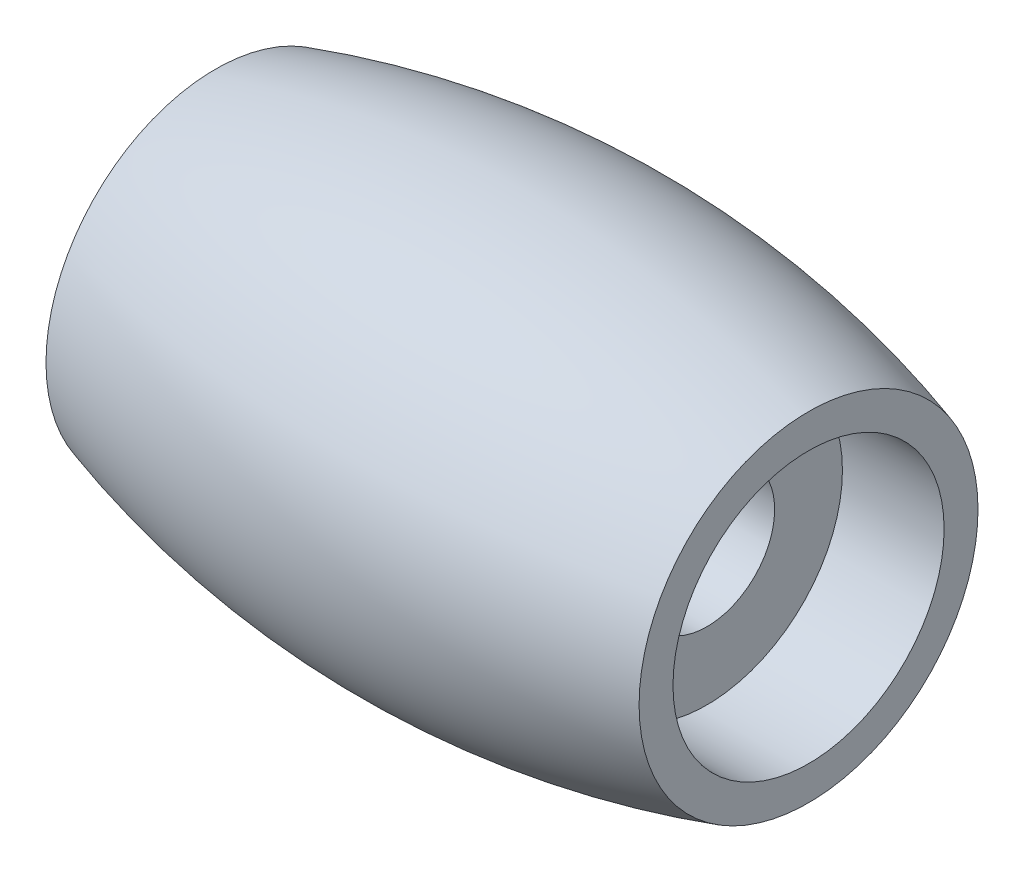
ISO-10303-21;
HEADER;
FILE_DESCRIPTION(('STEP AP214'),'2;1');
FILE_NAME('part.step','',(''),(''),'','','');
FILE_SCHEMA(('AUTOMOTIVE_DESIGN { 1 0 10303 214 1 1 1 1 }'));
ENDSEC;
DATA;
#1=APPLICATION_CONTEXT('core data for automotive mechanical design processes');
#2=APPLICATION_PROTOCOL_DEFINITION('international standard','automotive_design',2000,#1);
#3=PRODUCT_CONTEXT('',#1,'mechanical');
#4=PRODUCT('Part','Part','',(#3));
#5=PRODUCT_RELATED_PRODUCT_CATEGORY('part','',(#4));
#6=PRODUCT_DEFINITION_FORMATION('','',#4);
#7=PRODUCT_DEFINITION_CONTEXT('part definition',#1,'design');
#8=PRODUCT_DEFINITION('design','',#6,#7);
#9=PRODUCT_DEFINITION_SHAPE('','',#8);
#10=(LENGTH_UNIT() NAMED_UNIT(*) SI_UNIT(.MILLI.,.METRE.));
#11=(NAMED_UNIT(*) PLANE_ANGLE_UNIT() SI_UNIT($,.RADIAN.));
#12=(NAMED_UNIT(*) SI_UNIT($,.STERADIAN.) SOLID_ANGLE_UNIT());
#13=UNCERTAINTY_MEASURE_WITH_UNIT(LENGTH_MEASURE(1.E-05),#10,'distance_accuracy_value','');
#14=(GEOMETRIC_REPRESENTATION_CONTEXT(3) GLOBAL_UNCERTAINTY_ASSIGNED_CONTEXT((#13)) GLOBAL_UNIT_ASSIGNED_CONTEXT((#10,
#11,#12)) REPRESENTATION_CONTEXT('',''));
#15=CARTESIAN_POINT('',(0.,0.,0.));
#16=DIRECTION('',(0.,0.,1.));
#17=DIRECTION('',(1.,0.,0.));
#18=AXIS2_PLACEMENT_3D('',#15,#16,#17);
#19=CARTESIAN_POINT('',(2.875,1.,0.));
#20=DIRECTION('',(-1.,0.,0.));
#21=DIRECTION('',(0.,0.,1.));
#22=AXIS2_PLACEMENT_3D('',#19,#20,#21);
#23=PLANE('',#22);
#24=CARTESIAN_POINT('',(2.875,0.,0.));
#25=DIRECTION('',(-1.,0.,0.));
#26=DIRECTION('',(0.,0.,1.));
#27=AXIS2_PLACEMENT_3D('',#24,#25,#26);
#28=CIRCLE('',#27,2.);
#29=CARTESIAN_POINT('',(2.875,0.,2.));
#30=VERTEX_POINT('',#29);
#31=EDGE_CURVE('E78',#30,#30,#28,.T.);
#32=ORIENTED_EDGE('',*,*,#31,.F.);
#33=EDGE_LOOP('',(#32));
#34=FACE_BOUND('',#33,.T.);
#35=CARTESIAN_POINT('',(2.875,0.,0.));
#36=DIRECTION('',(-1.,0.,0.));
#37=DIRECTION('',(0.,0.,1.));
#38=AXIS2_PLACEMENT_3D('',#35,#36,#37);
#39=CIRCLE('',#38,1.);
#40=CARTESIAN_POINT('',(2.875,0.,1.));
#41=VERTEX_POINT('',#40);
#42=EDGE_CURVE('E10',#41,#41,#39,.T.);
#43=ORIENTED_EDGE('',*,*,#42,.T.);
#44=EDGE_LOOP('',(#43));
#45=FACE_BOUND('',#44,.T.);
#46=ADVANCED_FACE('F43',(#34,#45),#23,.F.);
#47=CARTESIAN_POINT('',(-8.91796875,0.,0.));
#48=DIRECTION('',(-1.,0.,0.));
#49=DIRECTION('',(0.,0.,1.));
#50=AXIS2_PLACEMENT_3D('',#47,#48,#49);
#51=CYLINDRICAL_SURFACE('',#50,1.);
#52=ORIENTED_EDGE('',*,*,#42,.F.);
#53=EDGE_LOOP('',(#52));
#54=FACE_BOUND('',#53,.T.);
#55=CARTESIAN_POINT('',(-2.875,0.,0.));
#56=DIRECTION('',(-1.,0.,0.));
#57=DIRECTION('',(0.,0.,1.));
#58=AXIS2_PLACEMENT_3D('',#55,#56,#57);
#59=CIRCLE('',#58,1.);
#60=CARTESIAN_POINT('',(-2.875,0.,1.));
#61=VERTEX_POINT('',#60);
#62=EDGE_CURVE('E50',#61,#61,#59,.T.);
#63=ORIENTED_EDGE('',*,*,#62,.T.);
#64=EDGE_LOOP('',(#63));
#65=FACE_BOUND('',#64,.T.);
#66=ADVANCED_FACE('F86',(#54,#65),#51,.F.);
#67=CARTESIAN_POINT('',(-2.875,1.,0.));
#68=DIRECTION('',(1.,0.,0.));
#69=DIRECTION('',(0.,0.,-1.));
#70=AXIS2_PLACEMENT_3D('',#67,#68,#69);
#71=PLANE('',#70);
#72=ORIENTED_EDGE('',*,*,#62,.F.);
#73=EDGE_LOOP('',(#72));
#74=FACE_BOUND('',#73,.T.);
#75=CARTESIAN_POINT('',(-2.875,0.,0.));
#76=DIRECTION('',(-1.,0.,0.));
#77=DIRECTION('',(0.,0.,1.));
#78=AXIS2_PLACEMENT_3D('',#75,#76,#77);
#79=CIRCLE('',#78,2.);
#80=CARTESIAN_POINT('',(-2.875,0.,2.));
#81=VERTEX_POINT('',#80);
#82=EDGE_CURVE('E55',#81,#81,#79,.T.);
#83=ORIENTED_EDGE('',*,*,#82,.T.);
#84=EDGE_LOOP('',(#83));
#85=FACE_BOUND('',#84,.T.);
#86=ADVANCED_FACE('F90',(#74,#85),#71,.F.);
#87=CARTESIAN_POINT('',(-8.91796875,0.,0.));
#88=DIRECTION('',(-1.,0.,0.));
#89=DIRECTION('',(0.,0.,1.));
#90=AXIS2_PLACEMENT_3D('',#87,#88,#89);
#91=CYLINDRICAL_SURFACE('',#90,2.);
#92=ORIENTED_EDGE('',*,*,#82,.F.);
#93=EDGE_LOOP('',(#92));
#94=FACE_BOUND('',#93,.T.);
#95=CARTESIAN_POINT('',(-4.375,0.,0.));
#96=DIRECTION('',(-1.,0.,0.));
#97=DIRECTION('',(0.,0.,1.));
#98=AXIS2_PLACEMENT_3D('',#95,#96,#97);
#99=CIRCLE('',#98,2.);
#100=CARTESIAN_POINT('',(-4.375,0.,2.));
#101=VERTEX_POINT('',#100);
#102=EDGE_CURVE('E60',#101,#101,#99,.T.);
#103=ORIENTED_EDGE('',*,*,#102,.T.);
#104=EDGE_LOOP('',(#103));
#105=FACE_BOUND('',#104,.T.);
#106=ADVANCED_FACE('F95',(#94,#105),#91,.F.);
#107=CARTESIAN_POINT('',(-4.375,2.,0.));
#108=DIRECTION('',(1.,0.,0.));
#109=DIRECTION('',(0.,0.,-1.));
#110=AXIS2_PLACEMENT_3D('',#107,#108,#109);
#111=PLANE('',#110);
#112=ORIENTED_EDGE('',*,*,#102,.F.);
#113=EDGE_LOOP('',(#112));
#114=FACE_BOUND('',#113,.T.);
#115=CARTESIAN_POINT('',(-4.375,0.,0.));
#116=DIRECTION('',(-1.,0.,0.));
#117=DIRECTION('',(0.,0.,1.));
#118=AXIS2_PLACEMENT_3D('',#115,#116,#117);
#119=CIRCLE('',#118,2.5);
#120=CARTESIAN_POINT('',(-4.375,0.,2.5));
#121=VERTEX_POINT('',#120);
#122=EDGE_CURVE('E66',#121,#121,#119,.T.);
#123=ORIENTED_EDGE('',*,*,#122,.T.);
#124=EDGE_LOOP('',(#123));
#125=FACE_BOUND('',#124,.T.);
#126=ADVANCED_FACE('F101',(#114,#125),#111,.F.);
#127=CARTESIAN_POINT('',(0.,0.,0.));
#128=DIRECTION('',(-1.,0.,0.));
#129=DIRECTION('',(0.,0.,1.));
#130=AXIS2_PLACEMENT_3D('',#127,#128,#129);
#131=DEGENERATE_TOROIDAL_SURFACE('',#130,11.8478003540612,15.,.F.);
#132=ORIENTED_EDGE('',*,*,#122,.F.);
#133=EDGE_LOOP('',(#132));
#134=FACE_BOUND('',#133,.T.);
#135=CARTESIAN_POINT('',(4.375,0.,0.));
#136=DIRECTION('',(-1.,0.,0.));
#137=DIRECTION('',(0.,0.,1.));
#138=AXIS2_PLACEMENT_3D('',#135,#136,#137);
#139=CIRCLE('',#138,2.5);
#140=CARTESIAN_POINT('',(4.375,0.,2.5));
#141=VERTEX_POINT('',#140);
#142=EDGE_CURVE('E70',#141,#141,#139,.T.);
#143=ORIENTED_EDGE('',*,*,#142,.T.);
#144=EDGE_LOOP('',(#143));
#145=FACE_BOUND('',#144,.T.);
#146=ADVANCED_FACE('F105',(#134,#145),#131,.F.);
#147=CARTESIAN_POINT('',(4.375,2.,0.));
#148=DIRECTION('',(-1.,0.,0.));
#149=DIRECTION('',(0.,0.,1.));
#150=AXIS2_PLACEMENT_3D('',#147,#148,#149);
#151=PLANE('',#150);
#152=ORIENTED_EDGE('',*,*,#142,.F.);
#153=EDGE_LOOP('',(#152));
#154=FACE_BOUND('',#153,.T.);
#155=CARTESIAN_POINT('',(4.375,0.,0.));
#156=DIRECTION('',(-1.,0.,0.));
#157=DIRECTION('',(0.,0.,1.));
#158=AXIS2_PLACEMENT_3D('',#155,#156,#157);
#159=CIRCLE('',#158,2.);
#160=CARTESIAN_POINT('',(4.375,0.,2.));
#161=VERTEX_POINT('',#160);
#162=EDGE_CURVE('E74',#161,#161,#159,.T.);
#163=ORIENTED_EDGE('',*,*,#162,.T.);
#164=EDGE_LOOP('',(#163));
#165=FACE_BOUND('',#164,.T.);
#166=ADVANCED_FACE('F109',(#154,#165),#151,.F.);
#167=CARTESIAN_POINT('',(-8.91796875,0.,0.));
#168=DIRECTION('',(-1.,0.,0.));
#169=DIRECTION('',(0.,0.,1.));
#170=AXIS2_PLACEMENT_3D('',#167,#168,#169);
#171=CYLINDRICAL_SURFACE('',#170,2.);
#172=ORIENTED_EDGE('',*,*,#162,.F.);
#173=EDGE_LOOP('',(#172));
#174=FACE_BOUND('',#173,.T.);
#175=ORIENTED_EDGE('',*,*,#31,.T.);
#176=EDGE_LOOP('',(#175));
#177=FACE_BOUND('',#176,.T.);
#178=ADVANCED_FACE('F83',(#174,#177),#171,.F.);
#179=CLOSED_SHELL('',(#46,#66,#86,#106,#126,#146,#166,#178));
#180=MANIFOLD_SOLID_BREP('B2',#179);
#181=ADVANCED_BREP_SHAPE_REPRESENTATION('',(#18,#180),#14);
#182=SHAPE_DEFINITION_REPRESENTATION(#9,#181);
ENDSEC;
END-ISO-10303-21;
